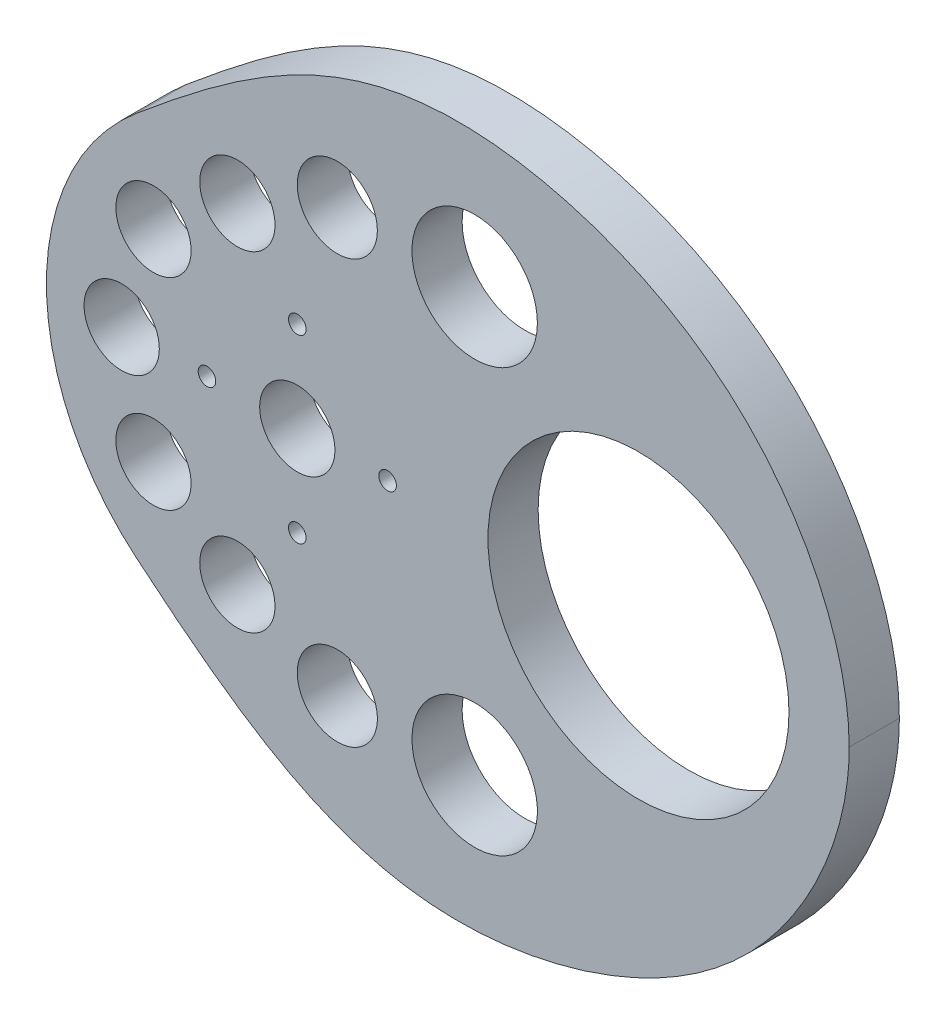
ISO-10303-21;
HEADER;
FILE_DESCRIPTION(('STEP AP214'),'2;1');
FILE_NAME('part.step','',(''),(''),'','','');
FILE_SCHEMA(('AUTOMOTIVE_DESIGN { 1 0 10303 214 1 1 1 1 }'));
ENDSEC;
DATA;
#1=APPLICATION_CONTEXT('core data for automotive mechanical design processes');
#2=APPLICATION_PROTOCOL_DEFINITION('international standard','automotive_design',2000,#1);
#3=PRODUCT_CONTEXT('',#1,'mechanical');
#4=PRODUCT('Part','Part','',(#3));
#5=PRODUCT_RELATED_PRODUCT_CATEGORY('part','',(#4));
#6=PRODUCT_DEFINITION_FORMATION('','',#4);
#7=PRODUCT_DEFINITION_CONTEXT('part definition',#1,'design');
#8=PRODUCT_DEFINITION('design','',#6,#7);
#9=PRODUCT_DEFINITION_SHAPE('','',#8);
#10=(LENGTH_UNIT() NAMED_UNIT(*) SI_UNIT(.MILLI.,.METRE.));
#11=(NAMED_UNIT(*) PLANE_ANGLE_UNIT() SI_UNIT($,.RADIAN.));
#12=(NAMED_UNIT(*) SI_UNIT($,.STERADIAN.) SOLID_ANGLE_UNIT());
#13=UNCERTAINTY_MEASURE_WITH_UNIT(LENGTH_MEASURE(1.E-05),#10,'distance_accuracy_value','');
#14=(GEOMETRIC_REPRESENTATION_CONTEXT(3) GLOBAL_UNCERTAINTY_ASSIGNED_CONTEXT((#13)) GLOBAL_UNIT_ASSIGNED_CONTEXT((#10,
#11,#12)) REPRESENTATION_CONTEXT('',''));
#15=CARTESIAN_POINT('',(0.,0.,0.));
#16=DIRECTION('',(0.,0.,1.));
#17=DIRECTION('',(1.,0.,0.));
#18=AXIS2_PLACEMENT_3D('',#15,#16,#17);
#19=CARTESIAN_POINT('',(-32.1393804843272,-38.3022221559487,10.));
#20=CARTESIAN_POINT('',(14.9090924089632,-77.7805784081633,10.));
#21=CARTESIAN_POINT('',(28.4220282639614,-78.5784366536183,10.));
#22=CARTESIAN_POINT('',(76.2151813455678,-61.8033711517291,10.));
#23=CARTESIAN_POINT('',(80.1030766559479,-61.4998590779614,10.));
#24=CARTESIAN_POINT('',(110.,-34.5900550764153,10.));
#25=CARTESIAN_POINT('',(110.,0.,10.));
#26=B_SPLINE_CURVE_WITH_KNOTS('',6,(#19,#20,#21,#22,#23,#24,#25),.UNSPECIFIED.,.F.,.F.,(7,7),
(0.,1.),.UNSPECIFIED.);
#27=DIRECTION('',(0.,0.,-1.));
#28=VECTOR('',#27,1.);
#29=SURFACE_OF_LINEAR_EXTRUSION('',#26,#28);
#30=CARTESIAN_POINT('',(-32.1393804843272,-38.3022221559487,0.));
#31=CARTESIAN_POINT('',(14.9090924089632,-77.7805784081633,0.));
#32=CARTESIAN_POINT('',(28.4220282639614,-78.5784366536183,0.));
#33=CARTESIAN_POINT('',(76.2151813455678,-61.8033711517291,0.));
#34=CARTESIAN_POINT('',(80.1030766559479,-61.4998590779614,0.));
#35=CARTESIAN_POINT('',(110.,-34.5900550764153,0.));
#36=CARTESIAN_POINT('',(110.,0.,0.));
#37=B_SPLINE_CURVE_WITH_KNOTS('',6,(#30,#31,#32,#33,#34,#35,#36),.UNSPECIFIED.,.F.,.F.,(7,7),
(0.,1.),.UNSPECIFIED.);
#38=CARTESIAN_POINT('',(-32.1393804843272,-38.3022221559487,0.));
#39=VERTEX_POINT('',#38);
#40=CARTESIAN_POINT('',(110.,0.,0.));
#41=VERTEX_POINT('',#40);
#42=EDGE_CURVE('E81',#39,#41,#37,.T.);
#43=ORIENTED_EDGE('',*,*,#42,.T.);
#44=DIRECTION('',(0.,0.,-1.));
#45=VECTOR('',#44,1.);
#46=CARTESIAN_POINT('',(110.,0.,10.));
#47=LINE('',#46,#45);
#48=CARTESIAN_POINT('',(110.,0.,10.));
#49=VERTEX_POINT('',#48);
#50=EDGE_CURVE('E11',#49,#41,#47,.T.);
#51=ORIENTED_EDGE('',*,*,#50,.F.);
#52=CARTESIAN_POINT('',(-32.1393804843272,-38.3022221559487,10.));
#53=VERTEX_POINT('',#52);
#54=EDGE_CURVE('E75',#53,#49,#26,.T.);
#55=ORIENTED_EDGE('',*,*,#54,.F.);
#56=DIRECTION('',(0.,0.,-1.));
#57=VECTOR('',#56,1.);
#58=CARTESIAN_POINT('',(-32.1393804843272,-38.3022221559487,10.));
#59=LINE('',#58,#57);
#60=EDGE_CURVE('E82',#53,#39,#59,.T.);
#61=ORIENTED_EDGE('',*,*,#60,.T.);
#62=EDGE_LOOP('',(#43,#51,#55,#61));
#63=FACE_BOUND('',#62,.T.);
#64=ADVANCED_FACE('F34',(#63),#29,.F.);
#65=CARTESIAN_POINT('',(110.,0.,10.));
#66=CARTESIAN_POINT('',(110.,34.5900550764153,10.));
#67=CARTESIAN_POINT('',(80.1030766559479,61.4998590779614,10.));
#68=CARTESIAN_POINT('',(76.2151813455678,61.8033711517291,10.));
#69=CARTESIAN_POINT('',(28.4220282639614,78.5784366536183,10.));
#70=CARTESIAN_POINT('',(14.9090924089632,77.7805784081633,10.));
#71=CARTESIAN_POINT('',(-32.1393804843272,38.3022221559487,10.));
#72=B_SPLINE_CURVE_WITH_KNOTS('',6,(#65,#66,#67,#68,#69,#70,#71),.UNSPECIFIED.,.F.,.F.,(7,7),
(0.,1.),.UNSPECIFIED.);
#73=DIRECTION('',(0.,0.,-1.));
#74=VECTOR('',#73,1.);
#75=SURFACE_OF_LINEAR_EXTRUSION('',#72,#74);
#76=CARTESIAN_POINT('',(110.,0.,0.));
#77=CARTESIAN_POINT('',(110.,34.5900550764153,0.));
#78=CARTESIAN_POINT('',(80.1030766559479,61.4998590779614,0.));
#79=CARTESIAN_POINT('',(76.2151813455678,61.8033711517291,0.));
#80=CARTESIAN_POINT('',(28.4220282639614,78.5784366536183,0.));
#81=CARTESIAN_POINT('',(14.9090924089632,77.7805784081633,0.));
#82=CARTESIAN_POINT('',(-32.1393804843272,38.3022221559487,0.));
#83=B_SPLINE_CURVE_WITH_KNOTS('',6,(#76,#77,#78,#79,#80,#81,#82),.UNSPECIFIED.,.F.,.F.,(7,7),
(0.,1.),.UNSPECIFIED.);
#84=CARTESIAN_POINT('',(-32.1393804843272,38.3022221559487,0.));
#85=VERTEX_POINT('',#84);
#86=EDGE_CURVE('E63',#41,#85,#83,.T.);
#87=ORIENTED_EDGE('',*,*,#86,.T.);
#88=DIRECTION('',(0.,0.,-1.));
#89=VECTOR('',#88,1.);
#90=CARTESIAN_POINT('',(-32.1393804843272,38.3022221559487,10.));
#91=LINE('',#90,#89);
#92=CARTESIAN_POINT('',(-32.1393804843272,38.3022221559487,10.));
#93=VERTEX_POINT('',#92);
#94=EDGE_CURVE('E43',#93,#85,#91,.T.);
#95=ORIENTED_EDGE('',*,*,#94,.F.);
#96=EDGE_CURVE('E71',#49,#93,#72,.T.);
#97=ORIENTED_EDGE('',*,*,#96,.F.);
#98=ORIENTED_EDGE('',*,*,#50,.T.);
#99=EDGE_LOOP('',(#87,#95,#97,#98));
#100=FACE_BOUND('',#99,.T.);
#101=ADVANCED_FACE('F72',(#100),#75,.F.);
#102=CARTESIAN_POINT('',(0.,0.,10.));
#103=DIRECTION('',(0.,0.,-1.));
#104=DIRECTION('',(-1.,0.,0.));
#105=AXIS2_PLACEMENT_3D('',#102,#103,#104);
#106=CYLINDRICAL_SURFACE('',#105,50.);
#107=CARTESIAN_POINT('',(0.,0.,0.));
#108=DIRECTION('',(0.,0.,1.));
#109=DIRECTION('',(-1.,0.,0.));
#110=AXIS2_PLACEMENT_3D('',#107,#108,#109);
#111=CIRCLE('',#110,50.);
#112=EDGE_CURVE('E68',#85,#39,#111,.T.);
#113=ORIENTED_EDGE('',*,*,#112,.T.);
#114=ORIENTED_EDGE('',*,*,#60,.F.);
#115=CARTESIAN_POINT('',(0.,0.,10.));
#116=DIRECTION('',(0.,0.,1.));
#117=DIRECTION('',(-1.,0.,0.));
#118=AXIS2_PLACEMENT_3D('',#115,#116,#117);
#119=CIRCLE('',#118,50.);
#120=EDGE_CURVE('E51',#93,#53,#119,.T.);
#121=ORIENTED_EDGE('',*,*,#120,.F.);
#122=ORIENTED_EDGE('',*,*,#94,.T.);
#123=EDGE_LOOP('',(#113,#114,#121,#122));
#124=FACE_BOUND('',#123,.T.);
#125=ADVANCED_FACE('F103',(#124),#106,.T.);
#126=CARTESIAN_POINT('',(62.1796152293664,-63.2776231573703,10.));
#127=DIRECTION('',(0.,0.,-1.));
#128=DIRECTION('',(-1.,0.,0.));
#129=AXIS2_PLACEMENT_3D('',#126,#127,#128);
#130=PLANE('',#129);
#131=CARTESIAN_POINT('',(7.97711838388251,-42.1324443715439,10.));
#132=DIRECTION('',(0.,0.,1.));
#133=DIRECTION('',(-1.,0.,0.));
#134=AXIS2_PLACEMENT_3D('',#131,#132,#133);
#135=CIRCLE('',#134,7.98177289212448);
#136=CARTESIAN_POINT('',(-0.00465450824196217,-42.1324443715439,10.));
#137=VERTEX_POINT('',#136);
#138=EDGE_CURVE('E190',#137,#137,#135,.T.);
#139=ORIENTED_EDGE('',*,*,#138,.F.);
#140=EDGE_LOOP('',(#139));
#141=FACE_BOUND('',#140,.T.);
#142=CARTESIAN_POINT('',(-28.661329204208,20.0880115553535,10.));
#143=DIRECTION('',(0.,0.,1.));
#144=DIRECTION('',(1.,0.,0.));
#145=AXIS2_PLACEMENT_3D('',#142,#143,#144);
#146=CIRCLE('',#145,7.5);
#147=CARTESIAN_POINT('',(-21.161329204208,20.0880115553535,10.));
#148=VERTEX_POINT('',#147);
#149=EDGE_CURVE('E201',#148,#148,#146,.T.);
#150=ORIENTED_EDGE('',*,*,#149,.F.);
#151=EDGE_LOOP('',(#150));
#152=FACE_BOUND('',#151,.T.);
#153=CARTESIAN_POINT('',(-11.9412452429705,32.8999492711954,10.));
#154=DIRECTION('',(0.,0.,1.));
#155=DIRECTION('',(1.,0.,0.));
#156=AXIS2_PLACEMENT_3D('',#153,#154,#155);
#157=CIRCLE('',#156,7.5);
#158=CARTESIAN_POINT('',(-4.44124524297054,32.8999492711954,10.));
#159=VERTEX_POINT('',#158);
#160=EDGE_CURVE('E202',#159,#159,#157,.T.);
#161=ORIENTED_EDGE('',*,*,#160,.F.);
#162=EDGE_LOOP('',(#161));
#163=FACE_BOUND('',#162,.T.);
#164=CARTESIAN_POINT('',(-11.9412452429705,-32.8999492711954,10.));
#165=DIRECTION('',(0.,0.,1.));
#166=DIRECTION('',(-1.,0.,0.));
#167=AXIS2_PLACEMENT_3D('',#164,#165,#166);
#168=CIRCLE('',#167,7.5);
#169=CARTESIAN_POINT('',(-19.4412452429705,-32.8999492711954,10.));
#170=VERTEX_POINT('',#169);
#171=EDGE_CURVE('E212',#170,#170,#168,.T.);
#172=ORIENTED_EDGE('',*,*,#171,.F.);
#173=EDGE_LOOP('',(#172));
#174=FACE_BOUND('',#173,.T.);
#175=CARTESIAN_POINT('',(68.,0.,10.));
#176=DIRECTION('',(0.,0.,1.));
#177=DIRECTION('',(1.,0.,0.));
#178=AXIS2_PLACEMENT_3D('',#175,#176,#177);
#179=CIRCLE('',#178,30.);
#180=CARTESIAN_POINT('',(98.,0.,10.));
#181=VERTEX_POINT('',#180);
#182=EDGE_CURVE('E177',#181,#181,#179,.T.);
#183=ORIENTED_EDGE('',*,*,#182,.F.);
#184=EDGE_LOOP('',(#183));
#185=FACE_BOUND('',#184,.T.);
#186=CARTESIAN_POINT('',(35.3533185327596,42.1324443715439,10.));
#187=DIRECTION('',(0.,0.,1.));
#188=DIRECTION('',(1.,0.,0.));
#189=AXIS2_PLACEMENT_3D('',#186,#187,#188);
#190=CIRCLE('',#189,12.5);
#191=CARTESIAN_POINT('',(47.8533185327596,42.1324443715439,10.));
#192=VERTEX_POINT('',#191);
#193=EDGE_CURVE('E171',#192,#192,#190,.T.);
#194=ORIENTED_EDGE('',*,*,#193,.F.);
#195=EDGE_LOOP('',(#194));
#196=FACE_BOUND('',#195,.T.);
#197=CARTESIAN_POINT('',(7.97711838388251,42.1324443715439,10.));
#198=DIRECTION('',(0.,0.,1.));
#199=DIRECTION('',(1.,0.,0.));
#200=AXIS2_PLACEMENT_3D('',#197,#198,#199);
#201=CIRCLE('',#200,7.98177289212448);
#202=CARTESIAN_POINT('',(15.958891276007,42.1324443715439,10.));
#203=VERTEX_POINT('',#202);
#204=EDGE_CURVE('E183',#203,#203,#201,.T.);
#205=ORIENTED_EDGE('',*,*,#204,.F.);
#206=EDGE_LOOP('',(#205));
#207=FACE_BOUND('',#206,.T.);
#208=CARTESIAN_POINT('',(35.3533185327596,-42.1324443715439,10.));
#209=DIRECTION('',(0.,0.,1.));
#210=DIRECTION('',(-1.,0.,0.));
#211=AXIS2_PLACEMENT_3D('',#208,#209,#210);
#212=CIRCLE('',#211,12.5);
#213=CARTESIAN_POINT('',(22.8533185327596,-42.1324443715439,10.));
#214=VERTEX_POINT('',#213);
#215=EDGE_CURVE('E189',#214,#214,#212,.T.);
#216=ORIENTED_EDGE('',*,*,#215,.F.);
#217=EDGE_LOOP('',(#216));
#218=FACE_BOUND('',#217,.T.);
#219=CARTESIAN_POINT('',(-28.661329204208,-20.0880115553535,10.));
#220=DIRECTION('',(0.,0.,1.));
#221=DIRECTION('',(-1.,0.,0.));
#222=AXIS2_PLACEMENT_3D('',#219,#220,#221);
#223=CIRCLE('',#222,7.5);
#224=CARTESIAN_POINT('',(-36.161329204208,-20.0880115553535,10.));
#225=VERTEX_POINT('',#224);
#226=EDGE_CURVE('E213',#225,#225,#223,.T.);
#227=ORIENTED_EDGE('',*,*,#226,.F.);
#228=EDGE_LOOP('',(#227));
#229=FACE_BOUND('',#228,.T.);
#230=CARTESIAN_POINT('',(-35.,0.,10.));
#231=DIRECTION('',(0.,0.,1.));
#232=DIRECTION('',(1.,0.,0.));
#233=AXIS2_PLACEMENT_3D('',#230,#231,#232);
#234=CIRCLE('',#233,7.5);
#235=CARTESIAN_POINT('',(-27.5,0.,10.));
#236=VERTEX_POINT('',#235);
#237=EDGE_CURVE('E148',#236,#236,#234,.T.);
#238=ORIENTED_EDGE('',*,*,#237,.F.);
#239=EDGE_LOOP('',(#238));
#240=FACE_BOUND('',#239,.T.);
#241=CARTESIAN_POINT('',(0.,18.,10.));
#242=DIRECTION('',(0.,0.,1.));
#243=DIRECTION('',(1.,0.,0.));
#244=AXIS2_PLACEMENT_3D('',#241,#242,#243);
#245=CIRCLE('',#244,1.75);
#246=CARTESIAN_POINT('',(1.75,18.,10.));
#247=VERTEX_POINT('',#246);
#248=EDGE_CURVE('E142',#247,#247,#245,.T.);
#249=ORIENTED_EDGE('',*,*,#248,.F.);
#250=EDGE_LOOP('',(#249));
#251=FACE_BOUND('',#250,.T.);
#252=CARTESIAN_POINT('',(18.,0.,10.));
#253=DIRECTION('',(0.,0.,1.));
#254=DIRECTION('',(1.,0.,0.));
#255=AXIS2_PLACEMENT_3D('',#252,#253,#254);
#256=CIRCLE('',#255,1.75);
#257=CARTESIAN_POINT('',(19.75,0.,10.));
#258=VERTEX_POINT('',#257);
#259=EDGE_CURVE('E160',#258,#258,#256,.T.);
#260=ORIENTED_EDGE('',*,*,#259,.F.);
#261=EDGE_LOOP('',(#260));
#262=FACE_BOUND('',#261,.T.);
#263=CARTESIAN_POINT('',(-18.,0.,10.));
#264=DIRECTION('',(0.,0.,1.));
#265=DIRECTION('',(1.,0.,0.));
#266=AXIS2_PLACEMENT_3D('',#263,#264,#265);
#267=CIRCLE('',#266,1.75);
#268=CARTESIAN_POINT('',(-16.25,0.,10.));
#269=VERTEX_POINT('',#268);
#270=EDGE_CURVE('E154',#269,#269,#267,.T.);
#271=ORIENTED_EDGE('',*,*,#270,.F.);
#272=EDGE_LOOP('',(#271));
#273=FACE_BOUND('',#272,.T.);
#274=CARTESIAN_POINT('',(0.,-18.,10.));
#275=DIRECTION('',(0.,0.,1.));
#276=DIRECTION('',(1.,0.,0.));
#277=AXIS2_PLACEMENT_3D('',#274,#275,#276);
#278=CIRCLE('',#277,1.75);
#279=CARTESIAN_POINT('',(1.75,-18.,10.));
#280=VERTEX_POINT('',#279);
#281=EDGE_CURVE('E147',#280,#280,#278,.T.);
#282=ORIENTED_EDGE('',*,*,#281,.F.);
#283=EDGE_LOOP('',(#282));
#284=FACE_BOUND('',#283,.T.);
#285=CARTESIAN_POINT('',(0.,0.,10.));
#286=DIRECTION('',(0.,0.,-1.));
#287=DIRECTION('',(-1.,0.,0.));
#288=AXIS2_PLACEMENT_3D('',#285,#286,#287);
#289=CIRCLE('',#288,7.5);
#290=CARTESIAN_POINT('',(-7.5,0.,10.));
#291=VERTEX_POINT('',#290);
#292=EDGE_CURVE('E88',#291,#291,#289,.T.);
#293=ORIENTED_EDGE('',*,*,#292,.T.);
#294=EDGE_LOOP('',(#293));
#295=FACE_BOUND('',#294,.T.);
#296=ORIENTED_EDGE('',*,*,#54,.T.);
#297=ORIENTED_EDGE('',*,*,#96,.T.);
#298=ORIENTED_EDGE('',*,*,#120,.T.);
#299=EDGE_LOOP('',(#296,#297,#298));
#300=FACE_BOUND('',#299,.T.);
#301=ADVANCED_FACE('F78',(#141,#152,#163,#174,#185,#196,#207,#218,#229,#240,#251,#262,#273,#284,
#295,#300),#130,.F.);
#302=CARTESIAN_POINT('',(62.1796152293664,-63.2776231573703,0.));
#303=DIRECTION('',(0.,0.,-1.));
#304=DIRECTION('',(-1.,0.,0.));
#305=AXIS2_PLACEMENT_3D('',#302,#303,#304);
#306=PLANE('',#305);
#307=CARTESIAN_POINT('',(7.97711838388251,-42.1324443715439,0.));
#308=DIRECTION('',(0.,0.,-1.));
#309=DIRECTION('',(-1.,0.,0.));
#310=AXIS2_PLACEMENT_3D('',#307,#308,#309);
#311=CIRCLE('',#310,7.98177289212448);
#312=CARTESIAN_POINT('',(-0.00465450824196217,-42.1324443715439,0.));
#313=VERTEX_POINT('',#312);
#314=EDGE_CURVE('E205',#313,#313,#311,.F.);
#315=ORIENTED_EDGE('',*,*,#314,.T.);
#316=EDGE_LOOP('',(#315));
#317=FACE_BOUND('',#316,.T.);
#318=CARTESIAN_POINT('',(-28.661329204208,20.0880115553535,0.));
#319=DIRECTION('',(0.,0.,-1.));
#320=DIRECTION('',(-1.,0.,0.));
#321=AXIS2_PLACEMENT_3D('',#318,#319,#320);
#322=CIRCLE('',#321,7.5);
#323=CARTESIAN_POINT('',(-36.161329204208,20.0880115553535,0.));
#324=VERTEX_POINT('',#323);
#325=EDGE_CURVE('E198',#324,#324,#322,.F.);
#326=ORIENTED_EDGE('',*,*,#325,.T.);
#327=EDGE_LOOP('',(#326));
#328=FACE_BOUND('',#327,.T.);
#329=CARTESIAN_POINT('',(-11.9412452429705,32.8999492711954,0.));
#330=DIRECTION('',(0.,0.,-1.));
#331=DIRECTION('',(-1.,0.,0.));
#332=AXIS2_PLACEMENT_3D('',#329,#330,#331);
#333=CIRCLE('',#332,7.5);
#334=CARTESIAN_POINT('',(-19.4412452429705,32.8999492711954,0.));
#335=VERTEX_POINT('',#334);
#336=EDGE_CURVE('E216',#335,#335,#333,.F.);
#337=ORIENTED_EDGE('',*,*,#336,.T.);
#338=EDGE_LOOP('',(#337));
#339=FACE_BOUND('',#338,.T.);
#340=CARTESIAN_POINT('',(-11.9412452429705,-32.8999492711954,0.));
#341=DIRECTION('',(0.,0.,-1.));
#342=DIRECTION('',(-1.,0.,0.));
#343=AXIS2_PLACEMENT_3D('',#340,#341,#342);
#344=CIRCLE('',#343,7.5);
#345=CARTESIAN_POINT('',(-19.4412452429705,-32.8999492711954,0.));
#346=VERTEX_POINT('',#345);
#347=EDGE_CURVE('E209',#346,#346,#344,.F.);
#348=ORIENTED_EDGE('',*,*,#347,.T.);
#349=EDGE_LOOP('',(#348));
#350=FACE_BOUND('',#349,.T.);
#351=CARTESIAN_POINT('',(68.,0.,0.));
#352=DIRECTION('',(0.,0.,-1.));
#353=DIRECTION('',(-1.,0.,0.));
#354=AXIS2_PLACEMENT_3D('',#351,#352,#353);
#355=CIRCLE('',#354,30.);
#356=CARTESIAN_POINT('',(38.,0.,0.));
#357=VERTEX_POINT('',#356);
#358=EDGE_CURVE('E180',#357,#357,#355,.F.);
#359=ORIENTED_EDGE('',*,*,#358,.T.);
#360=EDGE_LOOP('',(#359));
#361=FACE_BOUND('',#360,.T.);
#362=CARTESIAN_POINT('',(35.3533185327596,42.1324443715439,0.));
#363=DIRECTION('',(0.,0.,-1.));
#364=DIRECTION('',(-1.,0.,0.));
#365=AXIS2_PLACEMENT_3D('',#362,#363,#364);
#366=CIRCLE('',#365,12.5);
#367=CARTESIAN_POINT('',(22.8533185327596,42.1324443715439,0.));
#368=VERTEX_POINT('',#367);
#369=EDGE_CURVE('E174',#368,#368,#366,.F.);
#370=ORIENTED_EDGE('',*,*,#369,.T.);
#371=EDGE_LOOP('',(#370));
#372=FACE_BOUND('',#371,.T.);
#373=CARTESIAN_POINT('',(7.97711838388251,42.1324443715439,0.));
#374=DIRECTION('',(0.,0.,-1.));
#375=DIRECTION('',(-1.,0.,0.));
#376=AXIS2_PLACEMENT_3D('',#373,#374,#375);
#377=CIRCLE('',#376,7.98177289212448);
#378=CARTESIAN_POINT('',(-0.00465450824196217,42.1324443715439,0.));
#379=VERTEX_POINT('',#378);
#380=EDGE_CURVE('E193',#379,#379,#377,.F.);
#381=ORIENTED_EDGE('',*,*,#380,.T.);
#382=EDGE_LOOP('',(#381));
#383=FACE_BOUND('',#382,.T.);
#384=CARTESIAN_POINT('',(35.3533185327596,-42.1324443715439,0.));
#385=DIRECTION('',(0.,0.,-1.));
#386=DIRECTION('',(-1.,0.,0.));
#387=AXIS2_PLACEMENT_3D('',#384,#385,#386);
#388=CIRCLE('',#387,12.5);
#389=CARTESIAN_POINT('',(22.8533185327596,-42.1324443715439,0.));
#390=VERTEX_POINT('',#389);
#391=EDGE_CURVE('E186',#390,#390,#388,.F.);
#392=ORIENTED_EDGE('',*,*,#391,.T.);
#393=EDGE_LOOP('',(#392));
#394=FACE_BOUND('',#393,.T.);
#395=CARTESIAN_POINT('',(-28.661329204208,-20.0880115553535,0.));
#396=DIRECTION('',(0.,0.,-1.));
#397=DIRECTION('',(-1.,0.,0.));
#398=AXIS2_PLACEMENT_3D('',#395,#396,#397);
#399=CIRCLE('',#398,7.5);
#400=CARTESIAN_POINT('',(-36.161329204208,-20.0880115553535,0.));
#401=VERTEX_POINT('',#400);
#402=EDGE_CURVE('E221',#401,#401,#399,.F.);
#403=ORIENTED_EDGE('',*,*,#402,.T.);
#404=EDGE_LOOP('',(#403));
#405=FACE_BOUND('',#404,.T.);
#406=CARTESIAN_POINT('',(-35.,0.,0.));
#407=DIRECTION('',(0.,0.,-1.));
#408=DIRECTION('',(-1.,0.,0.));
#409=AXIS2_PLACEMENT_3D('',#406,#407,#408);
#410=CIRCLE('',#409,7.5);
#411=CARTESIAN_POINT('',(-42.5,0.,0.));
#412=VERTEX_POINT('',#411);
#413=EDGE_CURVE('E168',#412,#412,#410,.F.);
#414=ORIENTED_EDGE('',*,*,#413,.T.);
#415=EDGE_LOOP('',(#414));
#416=FACE_BOUND('',#415,.T.);
#417=CARTESIAN_POINT('',(0.,18.,0.));
#418=DIRECTION('',(0.,0.,-1.));
#419=DIRECTION('',(-1.,0.,0.));
#420=AXIS2_PLACEMENT_3D('',#417,#418,#419);
#421=CIRCLE('',#420,1.75);
#422=CARTESIAN_POINT('',(-1.75,18.,0.));
#423=VERTEX_POINT('',#422);
#424=EDGE_CURVE('E163',#423,#423,#421,.F.);
#425=ORIENTED_EDGE('',*,*,#424,.T.);
#426=EDGE_LOOP('',(#425));
#427=FACE_BOUND('',#426,.T.);
#428=CARTESIAN_POINT('',(18.,0.,0.));
#429=DIRECTION('',(0.,0.,-1.));
#430=DIRECTION('',(-1.,0.,0.));
#431=AXIS2_PLACEMENT_3D('',#428,#429,#430);
#432=CIRCLE('',#431,1.75);
#433=CARTESIAN_POINT('',(16.25,0.,0.));
#434=VERTEX_POINT('',#433);
#435=EDGE_CURVE('E157',#434,#434,#432,.F.);
#436=ORIENTED_EDGE('',*,*,#435,.T.);
#437=EDGE_LOOP('',(#436));
#438=FACE_BOUND('',#437,.T.);
#439=CARTESIAN_POINT('',(-18.,0.,0.));
#440=DIRECTION('',(0.,0.,-1.));
#441=DIRECTION('',(-1.,0.,0.));
#442=AXIS2_PLACEMENT_3D('',#439,#440,#441);
#443=CIRCLE('',#442,1.75);
#444=CARTESIAN_POINT('',(-19.75,0.,0.));
#445=VERTEX_POINT('',#444);
#446=EDGE_CURVE('E151',#445,#445,#443,.F.);
#447=ORIENTED_EDGE('',*,*,#446,.T.);
#448=EDGE_LOOP('',(#447));
#449=FACE_BOUND('',#448,.T.);
#450=CARTESIAN_POINT('',(0.,-18.,0.));
#451=DIRECTION('',(0.,0.,-1.));
#452=DIRECTION('',(-1.,0.,0.));
#453=AXIS2_PLACEMENT_3D('',#450,#451,#452);
#454=CIRCLE('',#453,1.75);
#455=CARTESIAN_POINT('',(-1.75,-18.,0.));
#456=VERTEX_POINT('',#455);
#457=EDGE_CURVE('E144',#456,#456,#454,.F.);
#458=ORIENTED_EDGE('',*,*,#457,.T.);
#459=EDGE_LOOP('',(#458));
#460=FACE_BOUND('',#459,.T.);
#461=CARTESIAN_POINT('',(0.,0.,0.));
#462=DIRECTION('',(0.,0.,1.));
#463=DIRECTION('',(1.,0.,0.));
#464=AXIS2_PLACEMENT_3D('',#461,#462,#463);
#465=CIRCLE('',#464,7.5);
#466=CARTESIAN_POINT('',(7.5,0.,0.));
#467=VERTEX_POINT('',#466);
#468=EDGE_CURVE('E84',#467,#467,#465,.T.);
#469=ORIENTED_EDGE('',*,*,#468,.T.);
#470=EDGE_LOOP('',(#469));
#471=FACE_BOUND('',#470,.T.);
#472=ORIENTED_EDGE('',*,*,#42,.F.);
#473=ORIENTED_EDGE('',*,*,#112,.F.);
#474=ORIENTED_EDGE('',*,*,#86,.F.);
#475=EDGE_LOOP('',(#472,#473,#474));
#476=FACE_BOUND('',#475,.T.);
#477=ADVANCED_FACE('F104',(#317,#328,#339,#350,#361,#372,#383,#394,#405,#416,#427,#438,#449,
#460,#471,#476),#306,.T.);
#478=CARTESIAN_POINT('',(0.,0.,10.001));
#479=DIRECTION('',(0.,0.,-1.));
#480=DIRECTION('',(-1.,0.,0.));
#481=AXIS2_PLACEMENT_3D('',#478,#479,#480);
#482=CYLINDRICAL_SURFACE('',#481,7.5);
#483=ORIENTED_EDGE('',*,*,#468,.F.);
#484=EDGE_LOOP('',(#483));
#485=FACE_BOUND('',#484,.T.);
#486=ORIENTED_EDGE('',*,*,#292,.F.);
#487=EDGE_LOOP('',(#486));
#488=FACE_BOUND('',#487,.T.);
#489=ADVANCED_FACE('F106',(#485,#488),#482,.F.);
#490=CARTESIAN_POINT('',(0.,-18.,-0.000999999999999265));
#491=DIRECTION('',(0.,0.,1.));
#492=DIRECTION('',(1.,0.,0.));
#493=AXIS2_PLACEMENT_3D('',#490,#491,#492);
#494=CYLINDRICAL_SURFACE('',#493,1.75);
#495=ORIENTED_EDGE('',*,*,#457,.F.);
#496=EDGE_LOOP('',(#495));
#497=FACE_BOUND('',#496,.T.);
#498=ORIENTED_EDGE('',*,*,#281,.T.);
#499=EDGE_LOOP('',(#498));
#500=FACE_BOUND('',#499,.T.);
#501=ADVANCED_FACE('F113',(#497,#500),#494,.F.);
#502=CARTESIAN_POINT('',(-18.,0.,-0.000999999999999265));
#503=DIRECTION('',(0.,0.,1.));
#504=DIRECTION('',(1.,0.,0.));
#505=AXIS2_PLACEMENT_3D('',#502,#503,#504);
#506=CYLINDRICAL_SURFACE('',#505,1.75);
#507=ORIENTED_EDGE('',*,*,#446,.F.);
#508=EDGE_LOOP('',(#507));
#509=FACE_BOUND('',#508,.T.);
#510=ORIENTED_EDGE('',*,*,#270,.T.);
#511=EDGE_LOOP('',(#510));
#512=FACE_BOUND('',#511,.T.);
#513=ADVANCED_FACE('F244',(#509,#512),#506,.F.);
#514=CARTESIAN_POINT('',(18.,0.,-0.000999999999999265));
#515=DIRECTION('',(0.,0.,1.));
#516=DIRECTION('',(1.,0.,0.));
#517=AXIS2_PLACEMENT_3D('',#514,#515,#516);
#518=CYLINDRICAL_SURFACE('',#517,1.75);
#519=ORIENTED_EDGE('',*,*,#435,.F.);
#520=EDGE_LOOP('',(#519));
#521=FACE_BOUND('',#520,.T.);
#522=ORIENTED_EDGE('',*,*,#259,.T.);
#523=EDGE_LOOP('',(#522));
#524=FACE_BOUND('',#523,.T.);
#525=ADVANCED_FACE('F250',(#521,#524),#518,.F.);
#526=CARTESIAN_POINT('',(0.,18.,-0.000999999999999265));
#527=DIRECTION('',(0.,0.,1.));
#528=DIRECTION('',(1.,0.,0.));
#529=AXIS2_PLACEMENT_3D('',#526,#527,#528);
#530=CYLINDRICAL_SURFACE('',#529,1.75);
#531=ORIENTED_EDGE('',*,*,#424,.F.);
#532=EDGE_LOOP('',(#531));
#533=FACE_BOUND('',#532,.T.);
#534=ORIENTED_EDGE('',*,*,#248,.T.);
#535=EDGE_LOOP('',(#534));
#536=FACE_BOUND('',#535,.T.);
#537=ADVANCED_FACE('F257',(#533,#536),#530,.F.);
#538=CARTESIAN_POINT('',(-35.,0.,-0.000999999999999265));
#539=DIRECTION('',(0.,0.,1.));
#540=DIRECTION('',(1.,0.,0.));
#541=AXIS2_PLACEMENT_3D('',#538,#539,#540);
#542=CYLINDRICAL_SURFACE('',#541,7.5);
#543=ORIENTED_EDGE('',*,*,#413,.F.);
#544=EDGE_LOOP('',(#543));
#545=FACE_BOUND('',#544,.T.);
#546=ORIENTED_EDGE('',*,*,#237,.T.);
#547=EDGE_LOOP('',(#546));
#548=FACE_BOUND('',#547,.T.);
#549=ADVANCED_FACE('F261',(#545,#548),#542,.F.);
#550=CARTESIAN_POINT('',(-28.661329204208,-20.0880115553535,-0.000999999999999265));
#551=DIRECTION('',(0.,0.,1.));
#552=DIRECTION('',(1.,0.,0.));
#553=AXIS2_PLACEMENT_3D('',#550,#551,#552);
#554=CYLINDRICAL_SURFACE('',#553,7.5);
#555=ORIENTED_EDGE('',*,*,#402,.F.);
#556=EDGE_LOOP('',(#555));
#557=FACE_BOUND('',#556,.T.);
#558=ORIENTED_EDGE('',*,*,#226,.T.);
#559=EDGE_LOOP('',(#558));
#560=FACE_BOUND('',#559,.T.);
#561=ADVANCED_FACE('F227',(#557,#560),#554,.F.);
#562=CARTESIAN_POINT('',(35.3533185327596,-42.1324443715439,-0.000999999999999265));
#563=DIRECTION('',(0.,0.,1.));
#564=DIRECTION('',(1.,0.,0.));
#565=AXIS2_PLACEMENT_3D('',#562,#563,#564);
#566=CYLINDRICAL_SURFACE('',#565,12.5);
#567=ORIENTED_EDGE('',*,*,#391,.F.);
#568=EDGE_LOOP('',(#567));
#569=FACE_BOUND('',#568,.T.);
#570=ORIENTED_EDGE('',*,*,#215,.T.);
#571=EDGE_LOOP('',(#570));
#572=FACE_BOUND('',#571,.T.);
#573=ADVANCED_FACE('F276',(#569,#572),#566,.F.);
#574=CARTESIAN_POINT('',(7.97711838388251,42.1324443715439,-0.000999999999999265));
#575=DIRECTION('',(0.,0.,1.));
#576=DIRECTION('',(1.,0.,0.));
#577=AXIS2_PLACEMENT_3D('',#574,#575,#576);
#578=CYLINDRICAL_SURFACE('',#577,7.98177289212448);
#579=ORIENTED_EDGE('',*,*,#380,.F.);
#580=EDGE_LOOP('',(#579));
#581=FACE_BOUND('',#580,.T.);
#582=ORIENTED_EDGE('',*,*,#204,.T.);
#583=EDGE_LOOP('',(#582));
#584=FACE_BOUND('',#583,.T.);
#585=ADVANCED_FACE('F270',(#581,#584),#578,.F.);
#586=CARTESIAN_POINT('',(35.3533185327596,42.1324443715439,-0.000999999999999265));
#587=DIRECTION('',(0.,0.,1.));
#588=DIRECTION('',(1.,0.,0.));
#589=AXIS2_PLACEMENT_3D('',#586,#587,#588);
#590=CYLINDRICAL_SURFACE('',#589,12.5);
#591=ORIENTED_EDGE('',*,*,#369,.F.);
#592=EDGE_LOOP('',(#591));
#593=FACE_BOUND('',#592,.T.);
#594=ORIENTED_EDGE('',*,*,#193,.T.);
#595=EDGE_LOOP('',(#594));
#596=FACE_BOUND('',#595,.T.);
#597=ADVANCED_FACE('F266',(#593,#596),#590,.F.);
#598=CARTESIAN_POINT('',(68.,0.,-0.000999999999999265));
#599=DIRECTION('',(0.,0.,1.));
#600=DIRECTION('',(1.,0.,0.));
#601=AXIS2_PLACEMENT_3D('',#598,#599,#600);
#602=CYLINDRICAL_SURFACE('',#601,30.);
#603=ORIENTED_EDGE('',*,*,#358,.F.);
#604=EDGE_LOOP('',(#603));
#605=FACE_BOUND('',#604,.T.);
#606=ORIENTED_EDGE('',*,*,#182,.T.);
#607=EDGE_LOOP('',(#606));
#608=FACE_BOUND('',#607,.T.);
#609=ADVANCED_FACE('F269',(#605,#608),#602,.F.);
#610=CARTESIAN_POINT('',(-11.9412452429705,-32.8999492711954,-0.000999999999999265));
#611=DIRECTION('',(0.,0.,1.));
#612=DIRECTION('',(1.,0.,0.));
#613=AXIS2_PLACEMENT_3D('',#610,#611,#612);
#614=CYLINDRICAL_SURFACE('',#613,7.5);
#615=ORIENTED_EDGE('',*,*,#347,.F.);
#616=EDGE_LOOP('',(#615));
#617=FACE_BOUND('',#616,.T.);
#618=ORIENTED_EDGE('',*,*,#171,.T.);
#619=EDGE_LOOP('',(#618));
#620=FACE_BOUND('',#619,.T.);
#621=ADVANCED_FACE('F274',(#617,#620),#614,.F.);
#622=CARTESIAN_POINT('',(-11.9412452429705,32.8999492711954,-0.000999999999999265));
#623=DIRECTION('',(0.,0.,1.));
#624=DIRECTION('',(1.,0.,0.));
#625=AXIS2_PLACEMENT_3D('',#622,#623,#624);
#626=CYLINDRICAL_SURFACE('',#625,7.5);
#627=ORIENTED_EDGE('',*,*,#336,.F.);
#628=EDGE_LOOP('',(#627));
#629=FACE_BOUND('',#628,.T.);
#630=ORIENTED_EDGE('',*,*,#160,.T.);
#631=EDGE_LOOP('',(#630));
#632=FACE_BOUND('',#631,.T.);
#633=ADVANCED_FACE('F287',(#629,#632),#626,.F.);
#634=CARTESIAN_POINT('',(-28.661329204208,20.0880115553535,-0.000999999999999265));
#635=DIRECTION('',(0.,0.,1.));
#636=DIRECTION('',(1.,0.,0.));
#637=AXIS2_PLACEMENT_3D('',#634,#635,#636);
#638=CYLINDRICAL_SURFACE('',#637,7.5);
#639=ORIENTED_EDGE('',*,*,#325,.F.);
#640=EDGE_LOOP('',(#639));
#641=FACE_BOUND('',#640,.T.);
#642=ORIENTED_EDGE('',*,*,#149,.T.);
#643=EDGE_LOOP('',(#642));
#644=FACE_BOUND('',#643,.T.);
#645=ADVANCED_FACE('F283',(#641,#644),#638,.F.);
#646=CARTESIAN_POINT('',(7.97711838388251,-42.1324443715439,-0.000999999999999265));
#647=DIRECTION('',(0.,0.,1.));
#648=DIRECTION('',(1.,0.,0.));
#649=AXIS2_PLACEMENT_3D('',#646,#647,#648);
#650=CYLINDRICAL_SURFACE('',#649,7.98177289212448);
#651=ORIENTED_EDGE('',*,*,#314,.F.);
#652=EDGE_LOOP('',(#651));
#653=FACE_BOUND('',#652,.T.);
#654=ORIENTED_EDGE('',*,*,#138,.T.);
#655=EDGE_LOOP('',(#654));
#656=FACE_BOUND('',#655,.T.);
#657=ADVANCED_FACE('F286',(#653,#656),#650,.F.);
#658=CLOSED_SHELL('',(#64,#101,#125,#301,#477,#489,#501,#513,#525,#537,#549,#561,#573,#585,#597,
#609,#621,#633,#645,#657));
#659=MANIFOLD_SOLID_BREP('B2',#658);
#660=ADVANCED_BREP_SHAPE_REPRESENTATION('',(#18,#659),#14);
#661=SHAPE_DEFINITION_REPRESENTATION(#9,#660);
ENDSEC;
END-ISO-10303-21;
